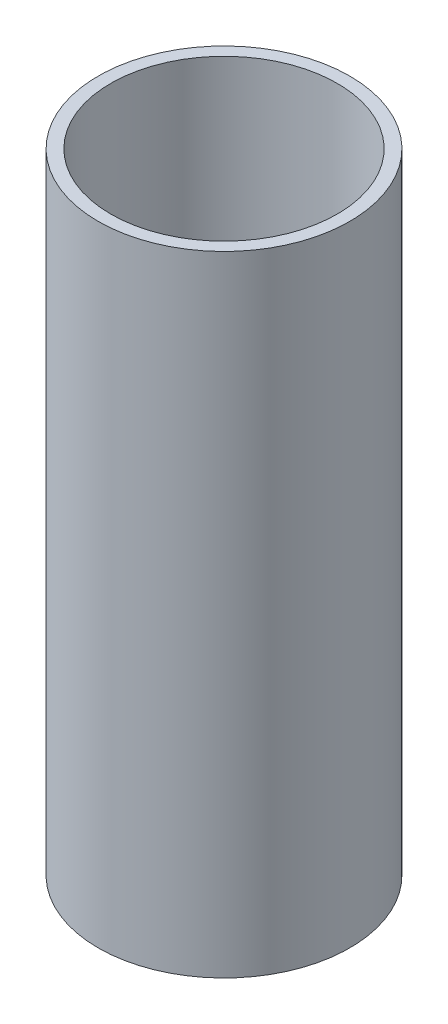
ISO-10303-21;
HEADER;
FILE_DESCRIPTION(('STEP AP214'),'2;1');
FILE_NAME('part.step','',(''),(''),'','','');
FILE_SCHEMA(('AUTOMOTIVE_DESIGN { 1 0 10303 214 1 1 1 1 }'));
ENDSEC;
DATA;
#1=APPLICATION_CONTEXT('core data for automotive mechanical design processes');
#2=APPLICATION_PROTOCOL_DEFINITION('international standard','automotive_design',2000,#1);
#3=PRODUCT_CONTEXT('',#1,'mechanical');
#4=PRODUCT('Part','Part','',(#3));
#5=PRODUCT_RELATED_PRODUCT_CATEGORY('part','',(#4));
#6=PRODUCT_DEFINITION_FORMATION('','',#4);
#7=PRODUCT_DEFINITION_CONTEXT('part definition',#1,'design');
#8=PRODUCT_DEFINITION('design','',#6,#7);
#9=PRODUCT_DEFINITION_SHAPE('','',#8);
#10=(LENGTH_UNIT() NAMED_UNIT(*) SI_UNIT(.MILLI.,.METRE.));
#11=(NAMED_UNIT(*) PLANE_ANGLE_UNIT() SI_UNIT($,.RADIAN.));
#12=(NAMED_UNIT(*) SI_UNIT($,.STERADIAN.) SOLID_ANGLE_UNIT());
#13=UNCERTAINTY_MEASURE_WITH_UNIT(LENGTH_MEASURE(1.E-05),#10,'distance_accuracy_value','');
#14=(GEOMETRIC_REPRESENTATION_CONTEXT(3) GLOBAL_UNCERTAINTY_ASSIGNED_CONTEXT((#13)) GLOBAL_UNIT_ASSIGNED_CONTEXT((#10,
#11,#12)) REPRESENTATION_CONTEXT('',''));
#15=CARTESIAN_POINT('',(0.,0.,0.));
#16=DIRECTION('',(0.,0.,1.));
#17=DIRECTION('',(1.,0.,0.));
#18=AXIS2_PLACEMENT_3D('',#15,#16,#17);
#19=CARTESIAN_POINT('',(0.,100.,0.));
#20=DIRECTION('',(0.,1.,0.));
#21=DIRECTION('',(0.,0.,1.));
#22=AXIS2_PLACEMENT_3D('',#19,#20,#21);
#23=PLANE('',#22);
#24=CARTESIAN_POINT('',(0.,100.,0.));
#25=DIRECTION('',(0.,1.,0.));
#26=DIRECTION('',(0.,0.,1.));
#27=AXIS2_PLACEMENT_3D('',#24,#25,#26);
#28=CIRCLE('',#27,20.);
#29=CARTESIAN_POINT('',(0.,100.,20.));
#30=VERTEX_POINT('',#29);
#31=EDGE_CURVE('E10',#30,#30,#28,.T.);
#32=ORIENTED_EDGE('',*,*,#31,.T.);
#33=EDGE_LOOP('',(#32));
#34=FACE_BOUND('',#33,.T.);
#35=CARTESIAN_POINT('',(0.,100.,0.));
#36=DIRECTION('',(0.,1.,0.));
#37=DIRECTION('',(0.,0.,1.));
#38=AXIS2_PLACEMENT_3D('',#35,#36,#37);
#39=CIRCLE('',#38,18.);
#40=CARTESIAN_POINT('',(0.,100.,18.));
#41=VERTEX_POINT('',#40);
#42=EDGE_CURVE('E56',#41,#41,#39,.T.);
#43=ORIENTED_EDGE('',*,*,#42,.F.);
#44=EDGE_LOOP('',(#43));
#45=FACE_BOUND('',#44,.T.);
#46=ADVANCED_FACE('F43',(#34,#45),#23,.T.);
#47=CARTESIAN_POINT('',(0.,0.,0.));
#48=DIRECTION('',(0.,1.,0.));
#49=DIRECTION('',(0.,0.,1.));
#50=AXIS2_PLACEMENT_3D('',#47,#48,#49);
#51=PLANE('',#50);
#52=CARTESIAN_POINT('',(0.,0.,0.));
#53=DIRECTION('',(0.,1.,0.));
#54=DIRECTION('',(0.,0.,1.));
#55=AXIS2_PLACEMENT_3D('',#52,#53,#54);
#56=CIRCLE('',#55,20.);
#57=CARTESIAN_POINT('',(0.,0.,20.));
#58=VERTEX_POINT('',#57);
#59=EDGE_CURVE('E47',#58,#58,#56,.T.);
#60=ORIENTED_EDGE('',*,*,#59,.F.);
#61=EDGE_LOOP('',(#60));
#62=FACE_BOUND('',#61,.T.);
#63=CARTESIAN_POINT('',(0.,0.,0.));
#64=DIRECTION('',(0.,1.,0.));
#65=DIRECTION('',(0.,0.,1.));
#66=AXIS2_PLACEMENT_3D('',#63,#64,#65);
#67=CIRCLE('',#66,18.);
#68=CARTESIAN_POINT('',(0.,0.,18.));
#69=VERTEX_POINT('',#68);
#70=EDGE_CURVE('E58',#69,#69,#67,.T.);
#71=ORIENTED_EDGE('',*,*,#70,.T.);
#72=EDGE_LOOP('',(#71));
#73=FACE_BOUND('',#72,.T.);
#74=ADVANCED_FACE('F70',(#62,#73),#51,.F.);
#75=CARTESIAN_POINT('',(0.,100.,0.));
#76=DIRECTION('',(0.,-1.,0.));
#77=DIRECTION('',(0.,0.,-1.));
#78=AXIS2_PLACEMENT_3D('',#75,#76,#77);
#79=CYLINDRICAL_SURFACE('',#78,20.);
#80=ORIENTED_EDGE('',*,*,#31,.F.);
#81=EDGE_LOOP('',(#80));
#82=FACE_BOUND('',#81,.T.);
#83=ORIENTED_EDGE('',*,*,#59,.T.);
#84=EDGE_LOOP('',(#83));
#85=FACE_BOUND('',#84,.T.);
#86=ADVANCED_FACE('F45',(#82,#85),#79,.T.);
#87=CARTESIAN_POINT('',(0.,100.,0.));
#88=DIRECTION('',(0.,-1.,0.));
#89=DIRECTION('',(0.,0.,-1.));
#90=AXIS2_PLACEMENT_3D('',#87,#88,#89);
#91=CYLINDRICAL_SURFACE('',#90,18.);
#92=ORIENTED_EDGE('',*,*,#42,.T.);
#93=EDGE_LOOP('',(#92));
#94=FACE_BOUND('',#93,.T.);
#95=ORIENTED_EDGE('',*,*,#70,.F.);
#96=EDGE_LOOP('',(#95));
#97=FACE_BOUND('',#96,.T.);
#98=ADVANCED_FACE('F66',(#94,#97),#91,.F.);
#99=CLOSED_SHELL('',(#46,#74,#86,#98));
#100=MANIFOLD_SOLID_BREP('B2',#99);
#101=ADVANCED_BREP_SHAPE_REPRESENTATION('',(#18,#100),#14);
#102=SHAPE_DEFINITION_REPRESENTATION(#9,#101);
ENDSEC;
END-ISO-10303-21;
